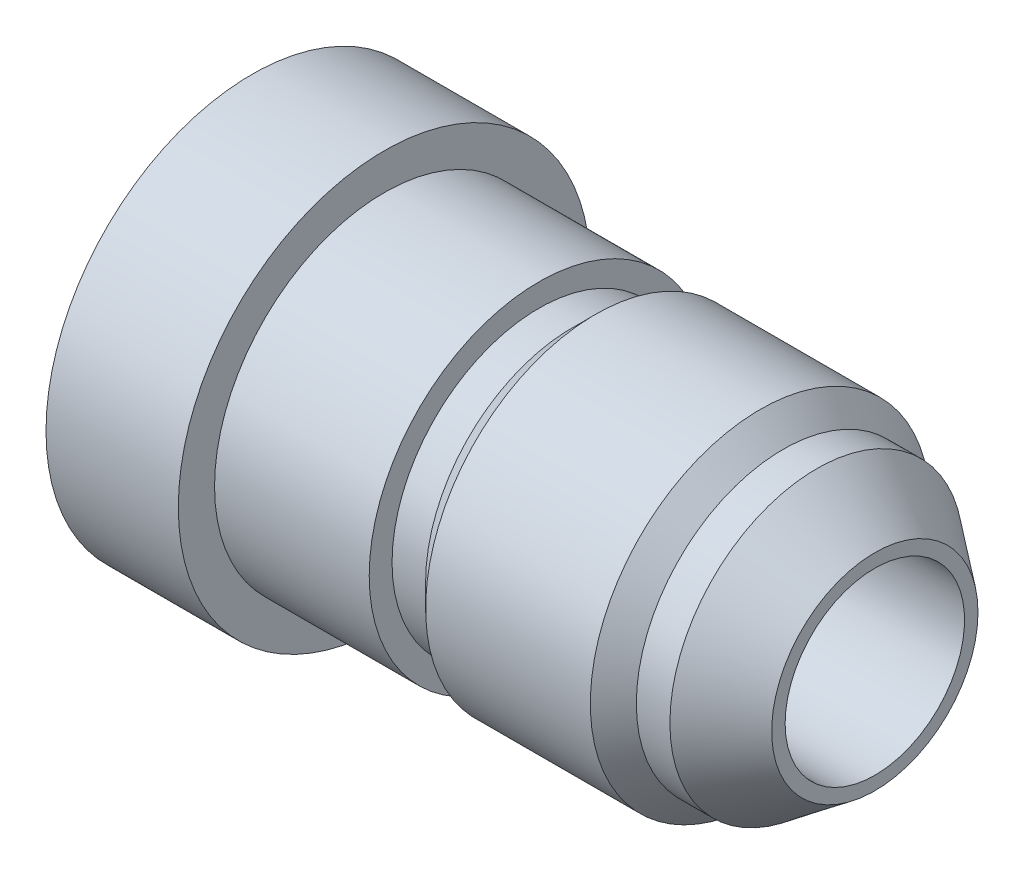
ISO-10303-21;
HEADER;
FILE_DESCRIPTION(('STEP AP214'),'2;1');
FILE_NAME('part.step','',(''),(''),'','','');
FILE_SCHEMA(('AUTOMOTIVE_DESIGN { 1 0 10303 214 1 1 1 1 }'));
ENDSEC;
DATA;
#1=APPLICATION_CONTEXT('core data for automotive mechanical design processes');
#2=APPLICATION_PROTOCOL_DEFINITION('international standard','automotive_design',2000,#1);
#3=PRODUCT_CONTEXT('',#1,'mechanical');
#4=PRODUCT('Part','Part','',(#3));
#5=PRODUCT_RELATED_PRODUCT_CATEGORY('part','',(#4));
#6=PRODUCT_DEFINITION_FORMATION('','',#4);
#7=PRODUCT_DEFINITION_CONTEXT('part definition',#1,'design');
#8=PRODUCT_DEFINITION('design','',#6,#7);
#9=PRODUCT_DEFINITION_SHAPE('','',#8);
#10=(LENGTH_UNIT() NAMED_UNIT(*) SI_UNIT(.MILLI.,.METRE.));
#11=(NAMED_UNIT(*) PLANE_ANGLE_UNIT() SI_UNIT($,.RADIAN.));
#12=(NAMED_UNIT(*) SI_UNIT($,.STERADIAN.) SOLID_ANGLE_UNIT());
#13=UNCERTAINTY_MEASURE_WITH_UNIT(LENGTH_MEASURE(1.E-05),#10,'distance_accuracy_value','');
#14=(GEOMETRIC_REPRESENTATION_CONTEXT(3) GLOBAL_UNCERTAINTY_ASSIGNED_CONTEXT((#13)) GLOBAL_UNIT_ASSIGNED_CONTEXT((#10,
#11,#12)) REPRESENTATION_CONTEXT('',''));
#15=CARTESIAN_POINT('',(0.,0.,0.));
#16=DIRECTION('',(0.,0.,1.));
#17=DIRECTION('',(1.,0.,0.));
#18=AXIS2_PLACEMENT_3D('',#15,#16,#17);
#19=CARTESIAN_POINT('',(13.0937,3.7719,0.));
#20=DIRECTION('',(-1.,0.,0.));
#21=DIRECTION('',(0.,0.,1.));
#22=AXIS2_PLACEMENT_3D('',#19,#20,#21);
#23=PLANE('',#22);
#24=CARTESIAN_POINT('',(13.0937,0.,0.));
#25=DIRECTION('',(1.,0.,0.));
#26=DIRECTION('',(0.,0.,-1.));
#27=AXIS2_PLACEMENT_3D('',#24,#25,#26);
#28=CIRCLE('',#27,4.337685);
#29=CARTESIAN_POINT('',(13.0937,0.,-4.337685));
#30=VERTEX_POINT('',#29);
#31=EDGE_CURVE('E65',#30,#30,#28,.T.);
#32=ORIENTED_EDGE('',*,*,#31,.T.);
#33=EDGE_LOOP('',(#32));
#34=FACE_BOUND('',#33,.T.);
#35=CARTESIAN_POINT('',(13.0937,0.,0.));
#36=DIRECTION('',(-1.,0.,0.));
#37=DIRECTION('',(0.,0.,1.));
#38=AXIS2_PLACEMENT_3D('',#35,#36,#37);
#39=CIRCLE('',#38,3.7719);
#40=CARTESIAN_POINT('',(13.0937,0.,3.7719));
#41=VERTEX_POINT('',#40);
#42=EDGE_CURVE('E51',#41,#41,#39,.T.);
#43=ORIENTED_EDGE('',*,*,#42,.T.);
#44=EDGE_LOOP('',(#43));
#45=FACE_BOUND('',#44,.T.);
#46=ADVANCED_FACE('F36',(#34,#45),#23,.F.);
#47=CARTESIAN_POINT('',(-13.0937,0.,0.));
#48=DIRECTION('',(-1.,0.,0.));
#49=DIRECTION('',(0.,0.,1.));
#50=AXIS2_PLACEMENT_3D('',#47,#48,#49);
#51=CYLINDRICAL_SURFACE('',#50,8.6614);
#52=CARTESIAN_POINT('',(-13.0937,0.,0.));
#53=DIRECTION('',(-1.,0.,0.));
#54=DIRECTION('',(0.,0.,1.));
#55=AXIS2_PLACEMENT_3D('',#52,#53,#54);
#56=CIRCLE('',#55,8.6614);
#57=CARTESIAN_POINT('',(-13.0937,0.,8.6614));
#58=VERTEX_POINT('',#57);
#59=EDGE_CURVE('E62',#58,#58,#56,.T.);
#60=ORIENTED_EDGE('',*,*,#59,.F.);
#61=EDGE_LOOP('',(#60));
#62=FACE_BOUND('',#61,.T.);
#63=CARTESIAN_POINT('',(-7.5311,0.,0.));
#64=DIRECTION('',(-1.,0.,0.));
#65=DIRECTION('',(0.,0.,1.));
#66=AXIS2_PLACEMENT_3D('',#63,#64,#65);
#67=CIRCLE('',#66,8.6614);
#68=CARTESIAN_POINT('',(-7.5311,0.,8.6614));
#69=VERTEX_POINT('',#68);
#70=EDGE_CURVE('E10',#69,#69,#67,.T.);
#71=ORIENTED_EDGE('',*,*,#70,.T.);
#72=EDGE_LOOP('',(#71));
#73=FACE_BOUND('',#72,.T.);
#74=ADVANCED_FACE('F38',(#62,#73),#51,.T.);
#75=CARTESIAN_POINT('',(-7.5311,8.6614,0.));
#76=DIRECTION('',(-1.,0.,0.));
#77=DIRECTION('',(0.,0.,1.));
#78=AXIS2_PLACEMENT_3D('',#75,#76,#77);
#79=PLANE('',#78);
#80=ORIENTED_EDGE('',*,*,#70,.F.);
#81=EDGE_LOOP('',(#80));
#82=FACE_BOUND('',#81,.T.);
#83=CARTESIAN_POINT('',(-7.5311,0.,0.));
#84=DIRECTION('',(-1.,0.,0.));
#85=DIRECTION('',(0.,0.,1.));
#86=AXIS2_PLACEMENT_3D('',#83,#84,#85);
#87=CIRCLE('',#86,7.1374);
#88=CARTESIAN_POINT('',(-7.5311,0.,7.1374));
#89=VERTEX_POINT('',#88);
#90=EDGE_CURVE('E43',#89,#89,#87,.T.);
#91=ORIENTED_EDGE('',*,*,#90,.T.);
#92=EDGE_LOOP('',(#91));
#93=FACE_BOUND('',#92,.T.);
#94=ADVANCED_FACE('F112',(#82,#93),#79,.F.);
#95=CARTESIAN_POINT('',(-13.0937,0.,0.));
#96=DIRECTION('',(-1.,0.,0.));
#97=DIRECTION('',(0.,0.,1.));
#98=AXIS2_PLACEMENT_3D('',#95,#96,#97);
#99=CYLINDRICAL_SURFACE('',#98,7.1374);
#100=ORIENTED_EDGE('',*,*,#90,.F.);
#101=EDGE_LOOP('',(#100));
#102=FACE_BOUND('',#101,.T.);
#103=CARTESIAN_POINT('',(-1.0287,0.,0.));
#104=DIRECTION('',(-1.,0.,0.));
#105=DIRECTION('',(0.,0.,1.));
#106=AXIS2_PLACEMENT_3D('',#103,#104,#105);
#107=CIRCLE('',#106,7.1374);
#108=CARTESIAN_POINT('',(-1.0287,0.,7.1374));
#109=VERTEX_POINT('',#108);
#110=EDGE_CURVE('E47',#109,#109,#107,.T.);
#111=ORIENTED_EDGE('',*,*,#110,.T.);
#112=EDGE_LOOP('',(#111));
#113=FACE_BOUND('',#112,.T.);
#114=ADVANCED_FACE('F122',(#102,#113),#99,.T.);
#115=CARTESIAN_POINT('',(-13.0937,0.,0.));
#116=DIRECTION('',(-1.,0.,0.));
#117=DIRECTION('',(0.,0.,1.));
#118=AXIS2_PLACEMENT_3D('',#115,#116,#117);
#119=CYLINDRICAL_SURFACE('',#118,7.14375);
#120=CARTESIAN_POINT('',(1.34975466344964,0.,0.));
#121=DIRECTION('',(1.,0.,0.));
#122=DIRECTION('',(0.,0.,-1.));
#123=AXIS2_PLACEMENT_3D('',#120,#121,#122);
#124=CIRCLE('',#123,7.14375);
#125=CARTESIAN_POINT('',(1.34975466344964,0.,-7.14375));
#126=VERTEX_POINT('',#125);
#127=EDGE_CURVE('E77',#126,#126,#124,.T.);
#128=ORIENTED_EDGE('',*,*,#127,.T.);
#129=EDGE_LOOP('',(#128));
#130=FACE_BOUND('',#129,.T.);
#131=CARTESIAN_POINT('',(8.27517956102879,0.,0.));
#132=DIRECTION('',(1.,0.,0.));
#133=DIRECTION('',(0.,0.,-1.));
#134=AXIS2_PLACEMENT_3D('',#131,#132,#133);
#135=CIRCLE('',#134,7.14375);
#136=CARTESIAN_POINT('',(8.27517956102879,0.,-7.14375));
#137=VERTEX_POINT('',#136);
#138=EDGE_CURVE('E74',#137,#137,#135,.T.);
#139=ORIENTED_EDGE('',*,*,#138,.F.);
#140=EDGE_LOOP('',(#139));
#141=FACE_BOUND('',#140,.T.);
#142=ADVANCED_FACE('F119',(#130,#141),#119,.T.);
#143=CARTESIAN_POINT('',(-13.0937,0.,0.));
#144=DIRECTION('',(-1.,0.,0.));
#145=DIRECTION('',(0.,0.,1.));
#146=AXIS2_PLACEMENT_3D('',#143,#144,#145);
#147=CYLINDRICAL_SURFACE('',#146,3.7719);
#148=ORIENTED_EDGE('',*,*,#42,.F.);
#149=EDGE_LOOP('',(#148));
#150=FACE_BOUND('',#149,.T.);
#151=CARTESIAN_POINT('',(-8.17248698350281,0.,0.));
#152=DIRECTION('',(-1.,0.,0.));
#153=DIRECTION('',(0.,0.,1.));
#154=AXIS2_PLACEMENT_3D('',#151,#152,#153);
#155=CIRCLE('',#154,3.7719);
#156=CARTESIAN_POINT('',(-8.17248698350281,0.,3.7719));
#157=VERTEX_POINT('',#156);
#158=EDGE_CURVE('E56',#157,#157,#155,.T.);
#159=ORIENTED_EDGE('',*,*,#158,.T.);
#160=EDGE_LOOP('',(#159));
#161=FACE_BOUND('',#160,.T.);
#162=ADVANCED_FACE('F117',(#150,#161),#147,.F.);
#163=CARTESIAN_POINT('',(-13.0937,0.,0.));
#164=DIRECTION('',(-1.,0.,0.));
#165=DIRECTION('',(0.,0.,1.));
#166=AXIS2_PLACEMENT_3D('',#163,#164,#165);
#167=CONICAL_SURFACE('',#166,7.4803,0.645771823237896);
#168=ORIENTED_EDGE('',*,*,#158,.F.);
#169=EDGE_LOOP('',(#168));
#170=FACE_BOUND('',#169,.T.);
#171=CARTESIAN_POINT('',(-13.0937,0.,0.));
#172=DIRECTION('',(-1.,0.,0.));
#173=DIRECTION('',(0.,0.,1.));
#174=AXIS2_PLACEMENT_3D('',#171,#172,#173);
#175=CIRCLE('',#174,7.4803);
#176=CARTESIAN_POINT('',(-13.0937,0.,7.4803));
#177=VERTEX_POINT('',#176);
#178=EDGE_CURVE('E59',#177,#177,#175,.T.);
#179=ORIENTED_EDGE('',*,*,#178,.T.);
#180=EDGE_LOOP('',(#179));
#181=FACE_BOUND('',#180,.T.);
#182=ADVANCED_FACE('F102',(#170,#181),#167,.F.);
#183=CARTESIAN_POINT('',(-13.0937,8.6614,0.));
#184=DIRECTION('',(1.,0.,0.));
#185=DIRECTION('',(0.,0.,-1.));
#186=AXIS2_PLACEMENT_3D('',#183,#184,#185);
#187=PLANE('',#186);
#188=ORIENTED_EDGE('',*,*,#178,.F.);
#189=EDGE_LOOP('',(#188));
#190=FACE_BOUND('',#189,.T.);
#191=ORIENTED_EDGE('',*,*,#59,.T.);
#192=EDGE_LOOP('',(#191));
#193=FACE_BOUND('',#192,.T.);
#194=ADVANCED_FACE('F92',(#190,#193),#187,.F.);
#195=CARTESIAN_POINT('',(-1.0287,0.,0.));
#196=DIRECTION('',(1.,0.,0.));
#197=DIRECTION('',(0.,0.,-1.));
#198=AXIS2_PLACEMENT_3D('',#195,#196,#197);
#199=PLANE('',#198);
#200=ORIENTED_EDGE('',*,*,#110,.F.);
#201=EDGE_LOOP('',(#200));
#202=FACE_BOUND('',#201,.T.);
#203=CARTESIAN_POINT('',(-1.0287,0.,0.));
#204=DIRECTION('',(1.,0.,0.));
#205=DIRECTION('',(0.,0.,-1.));
#206=AXIS2_PLACEMENT_3D('',#203,#204,#205);
#207=CIRCLE('',#206,6.17640644766146);
#208=CARTESIAN_POINT('',(-1.0287,0.,-6.17640644766146));
#209=VERTEX_POINT('',#208);
#210=EDGE_CURVE('E83',#209,#209,#207,.T.);
#211=ORIENTED_EDGE('',*,*,#210,.F.);
#212=EDGE_LOOP('',(#211));
#213=FACE_BOUND('',#212,.T.);
#214=ADVANCED_FACE('F89',(#202,#213),#199,.T.);
#215=CARTESIAN_POINT('',(10.6536342244784,0.,0.));
#216=DIRECTION('',(-1.,0.,0.));
#217=DIRECTION('',(0.,0.,1.));
#218=AXIS2_PLACEMENT_3D('',#215,#216,#217);
#219=CONICAL_SURFACE('',#218,6.17640644766146,0.645771823237896);
#220=ORIENTED_EDGE('',*,*,#31,.F.);
#221=EDGE_LOOP('',(#220));
#222=FACE_BOUND('',#221,.T.);
#223=CARTESIAN_POINT('',(10.6536342244784,0.,0.));
#224=DIRECTION('',(1.,0.,0.));
#225=DIRECTION('',(0.,0.,-1.));
#226=AXIS2_PLACEMENT_3D('',#223,#224,#225);
#227=CIRCLE('',#226,6.17640644766146);
#228=CARTESIAN_POINT('',(10.6536342244784,0.,-6.17640644766146));
#229=VERTEX_POINT('',#228);
#230=EDGE_CURVE('E68',#229,#229,#227,.T.);
#231=ORIENTED_EDGE('',*,*,#230,.T.);
#232=EDGE_LOOP('',(#231));
#233=FACE_BOUND('',#232,.T.);
#234=ADVANCED_FACE('F91',(#222,#233),#219,.T.);
#235=CARTESIAN_POINT('',(0.,0.,0.));
#236=DIRECTION('',(1.,0.,0.));
#237=DIRECTION('',(0.,0.,-1.));
#238=AXIS2_PLACEMENT_3D('',#235,#236,#237);
#239=CYLINDRICAL_SURFACE('',#238,6.17640644766146);
#240=ORIENTED_EDGE('',*,*,#230,.F.);
#241=EDGE_LOOP('',(#240));
#242=FACE_BOUND('',#241,.T.);
#243=CARTESIAN_POINT('',(9.24252311336733,0.,0.));
#244=DIRECTION('',(1.,0.,0.));
#245=DIRECTION('',(0.,0.,-1.));
#246=AXIS2_PLACEMENT_3D('',#243,#244,#245);
#247=CIRCLE('',#246,6.17640644766146);
#248=CARTESIAN_POINT('',(9.24252311336733,0.,-6.17640644766146));
#249=VERTEX_POINT('',#248);
#250=EDGE_CURVE('E71',#249,#249,#247,.T.);
#251=ORIENTED_EDGE('',*,*,#250,.T.);
#252=EDGE_LOOP('',(#251));
#253=FACE_BOUND('',#252,.T.);
#254=ADVANCED_FACE('F99',(#242,#253),#239,.T.);
#255=CARTESIAN_POINT('',(8.27517956102879,0.,0.));
#256=DIRECTION('',(-1.,0.,0.));
#257=DIRECTION('',(0.,0.,1.));
#258=AXIS2_PLACEMENT_3D('',#255,#256,#257);
#259=CONICAL_SURFACE('',#258,7.14375,0.78539816339745);
#260=ORIENTED_EDGE('',*,*,#138,.T.);
#261=EDGE_LOOP('',(#260));
#262=FACE_BOUND('',#261,.T.);
#263=ORIENTED_EDGE('',*,*,#250,.F.);
#264=EDGE_LOOP('',(#263));
#265=FACE_BOUND('',#264,.T.);
#266=ADVANCED_FACE('F187',(#262,#265),#259,.T.);
#267=CARTESIAN_POINT('',(0.382411111111112,0.,0.));
#268=DIRECTION('',(1.,0.,0.));
#269=DIRECTION('',(0.,0.,-1.));
#270=AXIS2_PLACEMENT_3D('',#267,#268,#269);
#271=CONICAL_SURFACE('',#270,6.17640644766146,0.78539816339745);
#272=ORIENTED_EDGE('',*,*,#127,.F.);
#273=EDGE_LOOP('',(#272));
#274=FACE_BOUND('',#273,.T.);
#275=CARTESIAN_POINT('',(0.382411111111112,0.,0.));
#276=DIRECTION('',(1.,0.,0.));
#277=DIRECTION('',(0.,0.,-1.));
#278=AXIS2_PLACEMENT_3D('',#275,#276,#277);
#279=CIRCLE('',#278,6.17640644766146);
#280=CARTESIAN_POINT('',(0.382411111111112,0.,-6.17640644766146));
#281=VERTEX_POINT('',#280);
#282=EDGE_CURVE('E80',#281,#281,#279,.T.);
#283=ORIENTED_EDGE('',*,*,#282,.T.);
#284=EDGE_LOOP('',(#283));
#285=FACE_BOUND('',#284,.T.);
#286=ADVANCED_FACE('F197',(#274,#285),#271,.T.);
#287=CARTESIAN_POINT('',(0.,0.,0.));
#288=DIRECTION('',(1.,0.,0.));
#289=DIRECTION('',(0.,0.,-1.));
#290=AXIS2_PLACEMENT_3D('',#287,#288,#289);
#291=CYLINDRICAL_SURFACE('',#290,6.17640644766146);
#292=ORIENTED_EDGE('',*,*,#282,.F.);
#293=EDGE_LOOP('',(#292));
#294=FACE_BOUND('',#293,.T.);
#295=ORIENTED_EDGE('',*,*,#210,.T.);
#296=EDGE_LOOP('',(#295));
#297=FACE_BOUND('',#296,.T.);
#298=ADVANCED_FACE('F87',(#294,#297),#291,.T.);
#299=CLOSED_SHELL('',(#46,#74,#94,#114,#142,#162,#182,#194,#214,#234,#254,#266,#286,#298));
#300=MANIFOLD_SOLID_BREP('B2',#299);
#301=ADVANCED_BREP_SHAPE_REPRESENTATION('',(#18,#300),#14);
#302=SHAPE_DEFINITION_REPRESENTATION(#9,#301);
ENDSEC;
END-ISO-10303-21;
